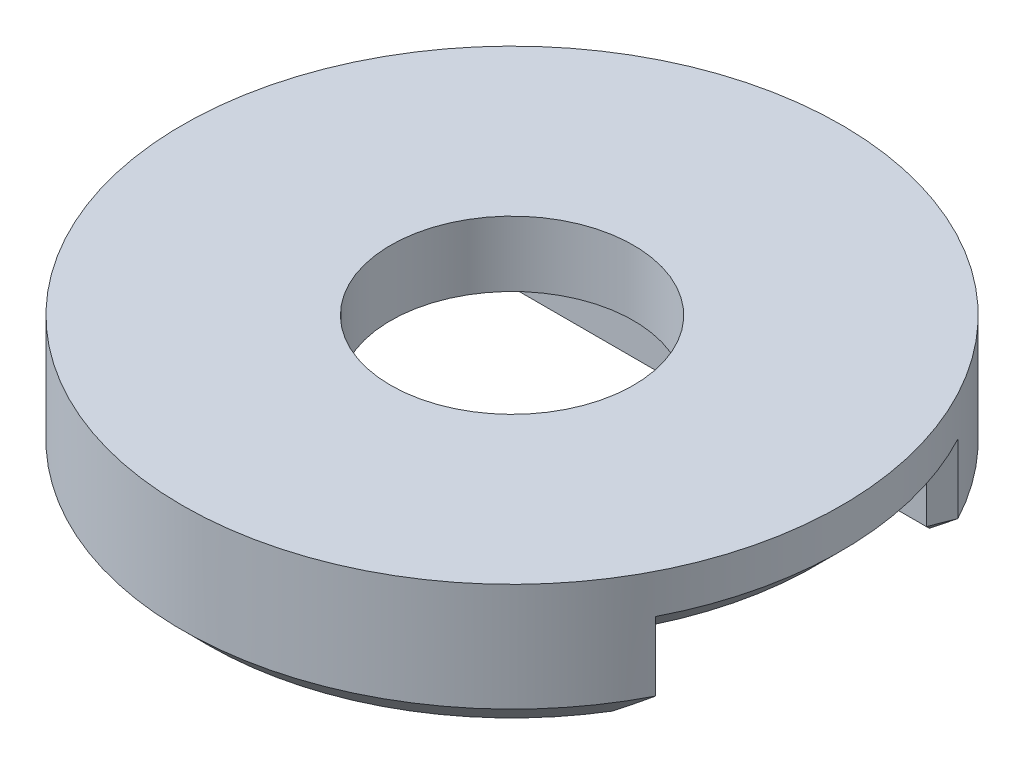
ISO-10303-21;
HEADER;
FILE_DESCRIPTION(('STEP AP214'),'2;1');
FILE_NAME('part.step','',(''),(''),'','','');
FILE_SCHEMA(('AUTOMOTIVE_DESIGN { 1 0 10303 214 1 1 1 1 }'));
ENDSEC;
DATA;
#1=APPLICATION_CONTEXT('core data for automotive mechanical design processes');
#2=APPLICATION_PROTOCOL_DEFINITION('international standard','automotive_design',2000,#1);
#3=PRODUCT_CONTEXT('',#1,'mechanical');
#4=PRODUCT('Part','Part','',(#3));
#5=PRODUCT_RELATED_PRODUCT_CATEGORY('part','',(#4));
#6=PRODUCT_DEFINITION_FORMATION('','',#4);
#7=PRODUCT_DEFINITION_CONTEXT('part definition',#1,'design');
#8=PRODUCT_DEFINITION('design','',#6,#7);
#9=PRODUCT_DEFINITION_SHAPE('','',#8);
#10=(LENGTH_UNIT() NAMED_UNIT(*) SI_UNIT(.MILLI.,.METRE.));
#11=(NAMED_UNIT(*) PLANE_ANGLE_UNIT() SI_UNIT($,.RADIAN.));
#12=(NAMED_UNIT(*) SI_UNIT($,.STERADIAN.) SOLID_ANGLE_UNIT());
#13=UNCERTAINTY_MEASURE_WITH_UNIT(LENGTH_MEASURE(1.E-05),#10,'distance_accuracy_value','');
#14=(GEOMETRIC_REPRESENTATION_CONTEXT(3) GLOBAL_UNCERTAINTY_ASSIGNED_CONTEXT((#13)) GLOBAL_UNIT_ASSIGNED_CONTEXT((#10,
#11,#12)) REPRESENTATION_CONTEXT('',''));
#15=CARTESIAN_POINT('',(0.,0.,0.));
#16=DIRECTION('',(0.,0.,1.));
#17=DIRECTION('',(1.,0.,0.));
#18=AXIS2_PLACEMENT_3D('',#15,#16,#17);
#19=CARTESIAN_POINT('',(0.,0.,0.));
#20=DIRECTION('',(0.,1.,0.));
#21=DIRECTION('',(0.,0.,1.));
#22=AXIS2_PLACEMENT_3D('',#19,#20,#21);
#23=PLANE('',#22);
#24=CARTESIAN_POINT('',(0.,0.,0.));
#25=DIRECTION('',(0.,1.,0.));
#26=DIRECTION('',(0.,0.,1.));
#27=AXIS2_PLACEMENT_3D('',#24,#25,#26);
#28=CIRCLE('',#27,23.622);
#29=CARTESIAN_POINT('',(0.,0.,23.622));
#30=VERTEX_POINT('',#29);
#31=EDGE_CURVE('E158',#30,#30,#28,.T.);
#32=ORIENTED_EDGE('',*,*,#31,.T.);
#33=EDGE_LOOP('',(#32));
#34=FACE_BOUND('',#33,.T.);
#35=DIRECTION('',(1.,0.,0.));
#36=VECTOR('',#35,1.);
#37=CARTESIAN_POINT('',(0.,0.,-25.7175));
#38=LINE('',#37,#36);
#39=CARTESIAN_POINT('',(-53.1611062596519,0.,-25.7175));
#40=VERTEX_POINT('',#39);
#41=CARTESIAN_POINT('',(53.1611062596519,0.,-25.7175));
#42=VERTEX_POINT('',#41);
#43=EDGE_CURVE('E159',#40,#42,#38,.T.);
#44=ORIENTED_EDGE('',*,*,#43,.T.);
#45=CARTESIAN_POINT('',(0.,0.,0.));
#46=DIRECTION('',(0.,1.,0.));
#47=DIRECTION('',(0.,0.,1.));
#48=AXIS2_PLACEMENT_3D('',#45,#46,#47);
#49=CIRCLE('',#48,59.055);
#50=CARTESIAN_POINT('',(53.1611062596519,0.,25.7175));
#51=VERTEX_POINT('',#50);
#52=EDGE_CURVE('E156',#42,#51,#49,.F.);
#53=ORIENTED_EDGE('',*,*,#52,.T.);
#54=DIRECTION('',(1.,0.,0.));
#55=VECTOR('',#54,1.);
#56=CARTESIAN_POINT('',(0.,0.,25.7175));
#57=LINE('',#56,#55);
#58=CARTESIAN_POINT('',(-53.1611062596519,0.,25.7175));
#59=VERTEX_POINT('',#58);
#60=EDGE_CURVE('E140',#59,#51,#57,.T.);
#61=ORIENTED_EDGE('',*,*,#60,.F.);
#62=CARTESIAN_POINT('',(0.,0.,0.));
#63=DIRECTION('',(0.,1.,0.));
#64=DIRECTION('',(0.,0.,1.));
#65=AXIS2_PLACEMENT_3D('',#62,#63,#64);
#66=CIRCLE('',#65,59.055);
#67=EDGE_CURVE('E153',#59,#40,#66,.F.);
#68=ORIENTED_EDGE('',*,*,#67,.T.);
#69=EDGE_LOOP('',(#44,#53,#61,#68));
#70=FACE_BOUND('',#69,.T.);
#71=ADVANCED_FACE('F39',(#34,#70),#23,.F.);
#72=CARTESIAN_POINT('',(0.,12.7,0.));
#73=DIRECTION('',(0.,-1.,0.));
#74=DIRECTION('',(0.,0.,-1.));
#75=AXIS2_PLACEMENT_3D('',#72,#73,#74);
#76=CYLINDRICAL_SURFACE('',#75,64.135);
#77=DIRECTION('',(0.,-1.,0.));
#78=VECTOR('',#77,1.);
#79=CARTESIAN_POINT('',(-56.6196296357669,12.7,30.125002322134));
#80=LINE('',#79,#78);
#81=CARTESIAN_POINT('',(-56.6196296357669,5.08,30.125002322134));
#82=VERTEX_POINT('',#81);
#83=CARTESIAN_POINT('',(-56.6196296357669,-8.3312,30.125002322134));
#84=VERTEX_POINT('',#83);
#85=EDGE_CURVE('E387',#82,#84,#80,.T.);
#86=ORIENTED_EDGE('',*,*,#85,.T.);
#87=CARTESIAN_POINT('',(0.,-8.3312,0.));
#88=DIRECTION('',(0.,1.,0.));
#89=DIRECTION('',(0.,0.,1.));
#90=AXIS2_PLACEMENT_3D('',#87,#88,#89);
#91=CIRCLE('',#90,64.135);
#92=CARTESIAN_POINT('',(57.1201882916864,-8.3312,29.1647443760834));
#93=VERTEX_POINT('',#92);
#94=EDGE_CURVE('E391',#84,#93,#91,.T.);
#95=ORIENTED_EDGE('',*,*,#94,.T.);
#96=DIRECTION('',(0.,-1.,0.));
#97=VECTOR('',#96,1.);
#98=CARTESIAN_POINT('',(57.1201882916864,12.7,29.1647443760834));
#99=LINE('',#98,#97);
#100=CARTESIAN_POINT('',(57.1201882916864,5.08,29.1647443760834));
#101=VERTEX_POINT('',#100);
#102=EDGE_CURVE('E384',#93,#101,#99,.F.);
#103=ORIENTED_EDGE('',*,*,#102,.T.);
#104=CARTESIAN_POINT('',(0.,5.08,0.));
#105=DIRECTION('',(0.,1.,0.));
#106=DIRECTION('',(0.,0.,1.));
#107=AXIS2_PLACEMENT_3D('',#104,#105,#106);
#108=CIRCLE('',#107,64.135);
#109=CARTESIAN_POINT('',(56.6196296357669,5.08,-30.1250023221341));
#110=VERTEX_POINT('',#109);
#111=EDGE_CURVE('E381',#101,#110,#108,.T.);
#112=ORIENTED_EDGE('',*,*,#111,.T.);
#113=DIRECTION('',(0.,-1.,0.));
#114=VECTOR('',#113,1.);
#115=CARTESIAN_POINT('',(56.6196296357669,12.7,-30.1250023221341));
#116=LINE('',#115,#114);
#117=CARTESIAN_POINT('',(56.6196296357669,-8.3312,-30.1250023221341));
#118=VERTEX_POINT('',#117);
#119=EDGE_CURVE('E372',#110,#118,#116,.T.);
#120=ORIENTED_EDGE('',*,*,#119,.T.);
#121=CARTESIAN_POINT('',(0.,-8.3312,0.));
#122=DIRECTION('',(0.,1.,0.));
#123=DIRECTION('',(0.,0.,1.));
#124=AXIS2_PLACEMENT_3D('',#121,#122,#123);
#125=CIRCLE('',#124,64.135);
#126=CARTESIAN_POINT('',(-57.1201882916864,-8.3312,-29.1647443760834));
#127=VERTEX_POINT('',#126);
#128=EDGE_CURVE('E369',#118,#127,#125,.T.);
#129=ORIENTED_EDGE('',*,*,#128,.T.);
#130=DIRECTION('',(0.,-1.,0.));
#131=VECTOR('',#130,1.);
#132=CARTESIAN_POINT('',(-57.1201882916864,12.7,-29.1647443760834));
#133=LINE('',#132,#131);
#134=CARTESIAN_POINT('',(-57.1201882916864,5.08,-29.1647443760834));
#135=VERTEX_POINT('',#134);
#136=EDGE_CURVE('E375',#127,#135,#133,.F.);
#137=ORIENTED_EDGE('',*,*,#136,.T.);
#138=CARTESIAN_POINT('',(0.,5.08,0.));
#139=DIRECTION('',(0.,1.,0.));
#140=DIRECTION('',(0.,0.,1.));
#141=AXIS2_PLACEMENT_3D('',#138,#139,#140);
#142=CIRCLE('',#141,64.135);
#143=EDGE_CURVE('E378',#135,#82,#142,.T.);
#144=ORIENTED_EDGE('',*,*,#143,.T.);
#145=EDGE_LOOP('',(#86,#95,#103,#112,#120,#129,#137,#144));
#146=FACE_BOUND('',#145,.T.);
#147=CARTESIAN_POINT('',(0.,12.7,0.));
#148=DIRECTION('',(0.,1.,0.));
#149=DIRECTION('',(0.,0.,1.));
#150=AXIS2_PLACEMENT_3D('',#147,#148,#149);
#151=CIRCLE('',#150,64.135);
#152=CARTESIAN_POINT('',(0.,12.7,64.135));
#153=VERTEX_POINT('',#152);
#154=EDGE_CURVE('E355',#153,#153,#151,.T.);
#155=ORIENTED_EDGE('',*,*,#154,.F.);
#156=EDGE_LOOP('',(#155));
#157=FACE_BOUND('',#156,.T.);
#158=ADVANCED_FACE('F331',(#146,#157),#76,.T.);
#159=CARTESIAN_POINT('',(0.,12.7,0.));
#160=DIRECTION('',(0.,-1.,0.));
#161=DIRECTION('',(0.,0.,-1.));
#162=AXIS2_PLACEMENT_3D('',#159,#160,#161);
#163=CYLINDRICAL_SURFACE('',#162,23.622);
#164=CARTESIAN_POINT('',(0.,12.7,0.));
#165=DIRECTION('',(0.,1.,0.));
#166=DIRECTION('',(0.,0.,1.));
#167=AXIS2_PLACEMENT_3D('',#164,#165,#166);
#168=CIRCLE('',#167,23.622);
#169=CARTESIAN_POINT('',(0.,12.7,23.622));
#170=VERTEX_POINT('',#169);
#171=EDGE_CURVE('E352',#170,#170,#168,.T.);
#172=ORIENTED_EDGE('',*,*,#171,.T.);
#173=EDGE_LOOP('',(#172));
#174=FACE_BOUND('',#173,.T.);
#175=ORIENTED_EDGE('',*,*,#31,.F.);
#176=EDGE_LOOP('',(#175));
#177=FACE_BOUND('',#176,.T.);
#178=ADVANCED_FACE('F337',(#174,#177),#163,.F.);
#179=CARTESIAN_POINT('',(0.,12.7,0.));
#180=DIRECTION('',(0.,1.,0.));
#181=DIRECTION('',(0.,0.,1.));
#182=AXIS2_PLACEMENT_3D('',#179,#180,#181);
#183=PLANE('',#182);
#184=ORIENTED_EDGE('',*,*,#154,.T.);
#185=EDGE_LOOP('',(#184));
#186=FACE_BOUND('',#185,.T.);
#187=ORIENTED_EDGE('',*,*,#171,.F.);
#188=EDGE_LOOP('',(#187));
#189=FACE_BOUND('',#188,.T.);
#190=ADVANCED_FACE('F342',(#186,#189),#183,.T.);
#191=CARTESIAN_POINT('',(0.,-13.4112,25.7175));
#192=DIRECTION('',(0.,0.,1.));
#193=DIRECTION('',(1.,0.,0.));
#194=AXIS2_PLACEMENT_3D('',#191,#192,#193);
#195=PLANE('',#194);
#196=DIRECTION('',(-1.,0.,0.));
#197=VECTOR('',#196,1.);
#198=CARTESIAN_POINT('',(0.,-8.3312,25.7175));
#199=LINE('',#198,#197);
#200=CARTESIAN_POINT('',(53.672943915603,-8.3312,25.7175));
#201=VERTEX_POINT('',#200);
#202=CARTESIAN_POINT('',(-54.8959048745212,-8.3312,25.7175));
#203=VERTEX_POINT('',#202);
#204=EDGE_CURVE('E362',#201,#203,#199,.T.);
#205=ORIENTED_EDGE('',*,*,#204,.T.);
#206=DIRECTION('',(0.,1.,0.));
#207=VECTOR('',#206,1.);
#208=CARTESIAN_POINT('',(-54.8959048745212,-13.4112,25.7175));
#209=LINE('',#208,#207);
#210=CARTESIAN_POINT('',(-54.8959048745212,1.56636734058775,25.7175));
#211=VERTEX_POINT('',#210);
#212=EDGE_CURVE('E143',#203,#211,#209,.T.);
#213=ORIENTED_EDGE('',*,*,#212,.T.);
#214=CARTESIAN_POINT('',(-54.8959048745212,1.56636734058775,25.7175));
#215=CARTESIAN_POINT('',(-54.6071569328278,1.30487954422318,25.7175));
#216=CARTESIAN_POINT('',(-54.3182164117731,1.04360503525342,25.7175));
#217=CARTESIAN_POINT('',(-53.7399502068221,0.521482588384765,25.7175));
#218=CARTESIAN_POINT('',(-53.4506245229204,0.260634650491936,25.7175));
#219=CARTESIAN_POINT('',(-53.1611062596519,0.,25.7175));
#220=B_SPLINE_CURVE_WITH_KNOTS('',3,(#214,#215,#216,#217,#218,#219),.UNSPECIFIED.,.F.,.F.,(4,2,
4),(0.,1.16865689734112,2.3373138113296),.UNSPECIFIED.);
#221=EDGE_CURVE('E55',#211,#59,#220,.T.);
#222=ORIENTED_EDGE('',*,*,#221,.T.);
#223=ORIENTED_EDGE('',*,*,#60,.T.);
#224=CARTESIAN_POINT('',(53.1611062596519,0.,25.7175));
#225=CARTESIAN_POINT('',(53.2464469957497,0.0768237334276907,25.7175));
#226=CARTESIAN_POINT('',(53.3317705018029,0.153666589846451,25.7175));
#227=CARTESIAN_POINT('',(53.5023830537866,0.307390548636063,25.7175));
#228=CARTESIAN_POINT('',(53.5876720997172,0.384271651006899,25.7175));
#229=CARTESIAN_POINT('',(53.672943915603,0.46117187636879,25.7175));
#230=B_SPLINE_CURVE_WITH_KNOTS('',3,(#224,#225,#226,#227,#228,#229),.UNSPECIFIED.,.F.,.F.,(4,2,
4),(0.,0.344476889515438,0.68895377889621),.UNSPECIFIED.);
#231=CARTESIAN_POINT('',(53.672943915603,0.461171876368791,25.7175));
#232=VERTEX_POINT('',#231);
#233=EDGE_CURVE('E149',#51,#232,#230,.T.);
#234=ORIENTED_EDGE('',*,*,#233,.T.);
#235=DIRECTION('',(0.,-1.,0.));
#236=VECTOR('',#235,1.);
#237=CARTESIAN_POINT('',(53.672943915603,-13.4112,25.7175));
#238=LINE('',#237,#236);
#239=EDGE_CURVE('E63',#232,#201,#238,.T.);
#240=ORIENTED_EDGE('',*,*,#239,.T.);
#241=EDGE_LOOP('',(#205,#213,#222,#223,#234,#240));
#242=FACE_BOUND('',#241,.T.);
#243=ADVANCED_FACE('F139',(#242),#195,.F.);
#244=CARTESIAN_POINT('',(0.,-13.4112,0.));
#245=DIRECTION('',(0.,1.,0.));
#246=DIRECTION('',(0.,0.,1.));
#247=AXIS2_PLACEMENT_3D('',#244,#245,#246);
#248=PLANE('',#247);
#249=CARTESIAN_POINT('',(0.,-13.4112,0.));
#250=DIRECTION('',(0.,1.,0.));
#251=DIRECTION('',(0.,0.,1.));
#252=AXIS2_PLACEMENT_3D('',#249,#250,#251);
#253=CIRCLE('',#252,59.055);
#254=CARTESIAN_POINT('',(50.388560395689,-13.4112,30.7975));
#255=VERTEX_POINT('',#254);
#256=CARTESIAN_POINT('',(-50.388560395689,-13.4112,30.7975));
#257=VERTEX_POINT('',#256);
#258=EDGE_CURVE('E169',#255,#257,#253,.F.);
#259=ORIENTED_EDGE('',*,*,#258,.T.);
#260=DIRECTION('',(1.,0.,0.));
#261=VECTOR('',#260,1.);
#262=CARTESIAN_POINT('',(0.,-13.4112,30.7975));
#263=LINE('',#262,#261);
#264=EDGE_CURVE('E176',#257,#255,#263,.T.);
#265=ORIENTED_EDGE('',*,*,#264,.T.);
#266=EDGE_LOOP('',(#259,#265));
#267=FACE_BOUND('',#266,.T.);
#268=ADVANCED_FACE('F209',(#267),#248,.F.);
#269=CARTESIAN_POINT('',(0.,-13.4112,-25.7175));
#270=DIRECTION('',(0.,0.,1.));
#271=DIRECTION('',(1.,0.,0.));
#272=AXIS2_PLACEMENT_3D('',#269,#270,#271);
#273=PLANE('',#272);
#274=ORIENTED_EDGE('',*,*,#43,.F.);
#275=CARTESIAN_POINT('',(-53.1611062596519,0.,-25.7175));
#276=CARTESIAN_POINT('',(-53.2464469957497,0.0768237334276886,-25.7175));
#277=CARTESIAN_POINT('',(-53.3317705018029,0.153666589846447,-25.7175));
#278=CARTESIAN_POINT('',(-53.5023830537866,0.307390548636055,-25.7175));
#279=CARTESIAN_POINT('',(-53.5876720997172,0.38427165100689,-25.7175));
#280=CARTESIAN_POINT('',(-53.672943915603,0.46117187636878,-25.7175));
#281=B_SPLINE_CURVE_WITH_KNOTS('',3,(#275,#276,#277,#278,#279,#280),.UNSPECIFIED.,.F.,.F.,(4,2,
4),(0.,0.344476889515429,0.688953778896193),.UNSPECIFIED.);
#282=CARTESIAN_POINT('',(-53.672943915603,0.461171876368778,-25.7175));
#283=VERTEX_POINT('',#282);
#284=EDGE_CURVE('E11',#40,#283,#281,.T.);
#285=ORIENTED_EDGE('',*,*,#284,.T.);
#286=DIRECTION('',(0.,-1.,0.));
#287=VECTOR('',#286,1.);
#288=CARTESIAN_POINT('',(-53.672943915603,-13.4112,-25.7175));
#289=LINE('',#288,#287);
#290=CARTESIAN_POINT('',(-53.672943915603,-8.3312,-25.7175));
#291=VERTEX_POINT('',#290);
#292=EDGE_CURVE('E165',#283,#291,#289,.T.);
#293=ORIENTED_EDGE('',*,*,#292,.T.);
#294=DIRECTION('',(1.,0.,0.));
#295=VECTOR('',#294,1.);
#296=CARTESIAN_POINT('',(58.7529439156031,-8.3312,-25.7175));
#297=LINE('',#296,#295);
#298=CARTESIAN_POINT('',(54.8959048745211,-8.3312,-25.7175));
#299=VERTEX_POINT('',#298);
#300=EDGE_CURVE('E394',#291,#299,#297,.T.);
#301=ORIENTED_EDGE('',*,*,#300,.T.);
#302=DIRECTION('',(0.,1.,0.));
#303=VECTOR('',#302,1.);
#304=CARTESIAN_POINT('',(54.8959048745211,0.,-25.7175));
#305=LINE('',#304,#303);
#306=CARTESIAN_POINT('',(54.8959048745211,1.56636734058771,-25.7175));
#307=VERTEX_POINT('',#306);
#308=EDGE_CURVE('E71',#299,#307,#305,.T.);
#309=ORIENTED_EDGE('',*,*,#308,.T.);
#310=CARTESIAN_POINT('',(54.8959048745211,1.56636734058771,-25.7175));
#311=CARTESIAN_POINT('',(54.6071569328278,1.30487954422314,-25.7175));
#312=CARTESIAN_POINT('',(54.3182164117731,1.04360503525339,-25.7175));
#313=CARTESIAN_POINT('',(53.7399502068221,0.521482588384747,-25.7175));
#314=CARTESIAN_POINT('',(53.4506245229204,0.260634650491926,-25.7175));
#315=CARTESIAN_POINT('',(53.1611062596519,0.,-25.7175));
#316=B_SPLINE_CURVE_WITH_KNOTS('',3,(#310,#311,#312,#313,#314,#315),.UNSPECIFIED.,.F.,.F.,(4,2,
4),(0.,1.16865689734109,2.33731381132953),.UNSPECIFIED.);
#317=EDGE_CURVE('E187',#307,#42,#316,.T.);
#318=ORIENTED_EDGE('',*,*,#317,.T.);
#319=EDGE_LOOP('',(#274,#285,#293,#301,#309,#318));
#320=FACE_BOUND('',#319,.T.);
#321=ADVANCED_FACE('F203',(#320),#273,.T.);
#322=CARTESIAN_POINT('',(0.,-13.4112,0.));
#323=DIRECTION('',(0.,1.,0.));
#324=DIRECTION('',(0.,0.,1.));
#325=AXIS2_PLACEMENT_3D('',#322,#323,#324);
#326=PLANE('',#325);
#327=CARTESIAN_POINT('',(0.,-13.4112,0.));
#328=DIRECTION('',(0.,1.,0.));
#329=DIRECTION('',(0.,0.,1.));
#330=AXIS2_PLACEMENT_3D('',#327,#328,#329);
#331=CIRCLE('',#330,59.055);
#332=CARTESIAN_POINT('',(-50.388560395689,-13.4112,-30.7975));
#333=VERTEX_POINT('',#332);
#334=CARTESIAN_POINT('',(50.388560395689,-13.4112,-30.7975));
#335=VERTEX_POINT('',#334);
#336=EDGE_CURVE('E180',#333,#335,#331,.F.);
#337=ORIENTED_EDGE('',*,*,#336,.T.);
#338=DIRECTION('',(-1.,0.,0.));
#339=VECTOR('',#338,1.);
#340=CARTESIAN_POINT('',(-58.7529439156031,-13.4112,-30.7975));
#341=LINE('',#340,#339);
#342=EDGE_CURVE('E183',#335,#333,#341,.T.);
#343=ORIENTED_EDGE('',*,*,#342,.T.);
#344=EDGE_LOOP('',(#337,#343));
#345=FACE_BOUND('',#344,.T.);
#346=ADVANCED_FACE('F208',(#345),#326,.F.);
#347=CARTESIAN_POINT('',(54.8959048745211,12.7,-25.7175));
#348=DIRECTION('',(0.931310886451406,0.,0.36422525005427));
#349=DIRECTION('',(0.,-1.,0.));
#350=AXIS2_PLACEMENT_3D('',#347,#348,#349);
#351=PLANE('',#350);
#352=DIRECTION('',(-0.36422525005427,0.,0.931310886451406));
#353=VECTOR('',#352,1.);
#354=CARTESIAN_POINT('',(56.6196296357669,-8.3312,-30.1250023221341));
#355=LINE('',#354,#353);
#356=EDGE_CURVE('E295',#118,#299,#355,.T.);
#357=ORIENTED_EDGE('',*,*,#356,.F.);
#358=ORIENTED_EDGE('',*,*,#119,.F.);
#359=CARTESIAN_POINT('',(54.8959048745211,1.56636734058771,-25.7175));
#360=CARTESIAN_POINT('',(55.0407588236509,1.85467225427372,-26.0878863467728));
#361=CARTESIAN_POINT('',(55.1852918696564,2.1441909156365,-26.4574521557795));
#362=CARTESIAN_POINT('',(55.47374048349,2.72551305980094,-27.195004904264));
#363=CARTESIAN_POINT('',(55.617656069791,3.01731647349943,-27.5629918909768));
#364=CARTESIAN_POINT('',(55.9049024560769,3.6030821003267,-28.2974705867893));
#365=CARTESIAN_POINT('',(56.0482332575327,3.89704430802018,-28.6639622996502));
#366=CARTESIAN_POINT('',(56.3343411905882,4.48701755648788,-29.3955300114304));
#367=CARTESIAN_POINT('',(56.477118305377,4.7830286587226,-29.7606059673644));
#368=CARTESIAN_POINT('',(56.6196296357669,5.07999999999998,-30.1250023221341));
#369=B_SPLINE_CURVE_WITH_KNOTS('',3,(#359,#360,#361,#362,#363,#364,#365,#366,#367,#368),
.UNSPECIFIED.,.F.,.F.,(4,2,2,2,4),(0.,1.47362990817354,2.94721541673099,4.42079721643346,
5.89442341227714),.UNSPECIFIED.);
#370=EDGE_CURVE('E44',#307,#110,#369,.T.);
#371=ORIENTED_EDGE('',*,*,#370,.F.);
#372=ORIENTED_EDGE('',*,*,#308,.F.);
#373=EDGE_LOOP('',(#357,#358,#371,#372));
#374=FACE_BOUND('',#373,.T.);
#375=ADVANCED_FACE('F41',(#374),#351,.T.);
#376=CARTESIAN_POINT('',(0.,5.08,0.));
#377=DIRECTION('',(0.,1.,0.));
#378=DIRECTION('',(0.,0.,1.));
#379=AXIS2_PLACEMENT_3D('',#376,#377,#378);
#380=CONICAL_SURFACE('',#379,64.135,0.78539816339745);
#381=ORIENTED_EDGE('',*,*,#370,.T.);
#382=ORIENTED_EDGE('',*,*,#111,.F.);
#383=CARTESIAN_POINT('',(57.1201882916864,5.08,29.1647443760834));
#384=CARTESIAN_POINT('',(56.8334750206249,4.69426679462589,28.8780311050219));
#385=CARTESIAN_POINT('',(56.546633141525,4.30872472818162,28.5911892259219));
#386=CARTESIAN_POINT('',(55.972676680568,3.5380477103738,28.017232764965));
#387=CARTESIAN_POINT('',(55.6855620990201,3.15291275854994,27.730118183417));
#388=CARTESIAN_POINT('',(55.1110440636127,2.38307388846689,27.1556001480097));
#389=CARTESIAN_POINT('',(54.8236406097192,1.99836997025854,26.8681966941162));
#390=CARTESIAN_POINT('',(54.2485267963694,1.22942030424789,26.2930828807663));
#391=CARTESIAN_POINT('',(53.9608164365659,0.845174556964751,26.0053725209629));
#392=CARTESIAN_POINT('',(53.672943915603,0.461171876368791,25.7175));
#393=B_SPLINE_CURVE_WITH_KNOTS('',3,(#383,#384,#385,#386,#387,#388,#389,#390,#391,#392),
.UNSPECIFIED.,.F.,.F.,(4,2,2,2,4),(0.,1.67892581721045,3.3578497340127,5.03677384879088,
6.71569986418836),.UNSPECIFIED.);
#394=EDGE_CURVE('E289',#232,#101,#393,.F.);
#395=ORIENTED_EDGE('',*,*,#394,.F.);
#396=ORIENTED_EDGE('',*,*,#233,.F.);
#397=ORIENTED_EDGE('',*,*,#52,.F.);
#398=ORIENTED_EDGE('',*,*,#317,.F.);
#399=EDGE_LOOP('',(#381,#382,#395,#396,#397,#398));
#400=FACE_BOUND('',#399,.T.);
#401=ADVANCED_FACE('F200',(#400),#380,.T.);
#402=CARTESIAN_POINT('',(56.6196296357669,-8.3312,-30.1250023221341));
#403=DIRECTION('',(0.598989480804955,-0.765724987981278,0.234258072787432));
#404=DIRECTION('',(0.78764154969396,0.616133742945228,0.));
#405=AXIS2_PLACEMENT_3D('',#402,#403,#404);
#406=PLANE('',#405);
#407=CARTESIAN_POINT('',(77.1928643713152,26.2141725894024,30.189264119071));
#408=DIRECTION('',(0.598989480804955,-0.765724987981278,0.234258072787432));
#409=DIRECTION('',(0.713128017334837,0.643168129481764,0.278896375220284));
#410=AXIS2_PLACEMENT_3D('',#407,#408,#409);
#411=ELLIPSE('',#410,128.871819698034,53.5507792332101);
#412=EDGE_CURVE('E281',#118,#335,#411,.F.);
#413=ORIENTED_EDGE('',*,*,#412,.F.);
#414=ORIENTED_EDGE('',*,*,#356,.T.);
#415=DIRECTION('',(-0.531457912857831,-0.598979334727333,-0.598979334727334));
#416=VECTOR('',#415,1.);
#417=CARTESIAN_POINT('',(53.9797162640098,-9.36378984602917,-26.7500898460292));
#418=LINE('',#417,#416);
#419=EDGE_CURVE('E285',#335,#299,#418,.F.);
#420=ORIENTED_EDGE('',*,*,#419,.F.);
#421=EDGE_LOOP('',(#413,#414,#420));
#422=FACE_BOUND('',#421,.T.);
#423=ADVANCED_FACE('F301',(#422),#406,.T.);
#424=CARTESIAN_POINT('',(57.1201882916864,12.7,29.1647443760834));
#425=DIRECTION('',(0.707106781186545,0.,-0.70710678118655));
#426=DIRECTION('',(0.,-1.,0.));
#427=AXIS2_PLACEMENT_3D('',#424,#425,#426);
#428=PLANE('',#427);
#429=ORIENTED_EDGE('',*,*,#394,.T.);
#430=ORIENTED_EDGE('',*,*,#102,.F.);
#431=DIRECTION('',(0.70710678118655,0.,0.707106781186545));
#432=VECTOR('',#431,1.);
#433=CARTESIAN_POINT('',(53.672943915603,-8.3312,25.7175));
#434=LINE('',#433,#432);
#435=EDGE_CURVE('E277',#201,#93,#434,.T.);
#436=ORIENTED_EDGE('',*,*,#435,.F.);
#437=ORIENTED_EDGE('',*,*,#239,.F.);
#438=EDGE_LOOP('',(#429,#430,#436,#437));
#439=FACE_BOUND('',#438,.T.);
#440=ADVANCED_FACE('F296',(#439),#428,.T.);
#441=CARTESIAN_POINT('',(0.,-8.3312,-25.7175));
#442=DIRECTION('',(0.,-0.707106781186548,0.707106781186547));
#443=DIRECTION('',(-1.,0.,0.));
#444=AXIS2_PLACEMENT_3D('',#441,#442,#443);
#445=PLANE('',#444);
#446=ORIENTED_EDGE('',*,*,#419,.T.);
#447=ORIENTED_EDGE('',*,*,#300,.F.);
#448=DIRECTION('',(-0.415778143838364,0.643089626376574,0.643089626376576));
#449=VECTOR('',#448,1.);
#450=CARTESIAN_POINT('',(-53.672943915603,-8.3312,-25.7175));
#451=LINE('',#450,#449);
#452=EDGE_CURVE('E273',#333,#291,#451,.T.);
#453=ORIENTED_EDGE('',*,*,#452,.F.);
#454=ORIENTED_EDGE('',*,*,#342,.F.);
#455=EDGE_LOOP('',(#446,#447,#453,#454));
#456=FACE_BOUND('',#455,.T.);
#457=ADVANCED_FACE('F300',(#456),#445,.T.);
#458=CARTESIAN_POINT('',(0.,-8.3312,0.));
#459=DIRECTION('',(0.,1.,0.));
#460=DIRECTION('',(0.,0.,1.));
#461=AXIS2_PLACEMENT_3D('',#458,#459,#460);
#462=CONICAL_SURFACE('',#461,64.135,0.78539816339745);
#463=ORIENTED_EDGE('',*,*,#412,.T.);
#464=ORIENTED_EDGE('',*,*,#336,.F.);
#465=CARTESIAN_POINT('',(-109.194719497002,107.326420516213,109.194719497003));
#466=DIRECTION('',(-0.460723433468101,-0.758595963413151,0.460723433468103));
#467=DIRECTION('',(-0.53640834991018,0.651561328113688,0.536408349910183));
#468=AXIS2_PLACEMENT_3D('',#465,#466,#467);
#469=ELLIPSE('',#468,237.007088341562,92.0782974431483);
#470=EDGE_CURVE('E270',#127,#333,#469,.T.);
#471=ORIENTED_EDGE('',*,*,#470,.F.);
#472=ORIENTED_EDGE('',*,*,#128,.F.);
#473=EDGE_LOOP('',(#463,#464,#471,#472));
#474=FACE_BOUND('',#473,.T.);
#475=ADVANCED_FACE('F304',(#474),#462,.T.);
#476=CARTESIAN_POINT('',(53.672943915603,-8.3312,25.7175));
#477=DIRECTION('',(0.4607234334681,-0.758595963413152,-0.460723433468103));
#478=DIRECTION('',(0.,0.519099402857157,-0.854713876073943));
#479=AXIS2_PLACEMENT_3D('',#476,#477,#478);
#480=PLANE('',#479);
#481=DIRECTION('',(-0.415778143838366,-0.643089626376573,0.643089626376575));
#482=VECTOR('',#481,1.);
#483=CARTESIAN_POINT('',(53.672943915603,-8.3312,25.7175));
#484=LINE('',#483,#482);
#485=EDGE_CURVE('E262',#201,#255,#484,.T.);
#486=ORIENTED_EDGE('',*,*,#485,.F.);
#487=ORIENTED_EDGE('',*,*,#435,.T.);
#488=CARTESIAN_POINT('',(109.194719497001,107.326420516211,-109.194719497001));
#489=DIRECTION('',(0.4607234334681,-0.758595963413152,-0.460723433468103));
#490=DIRECTION('',(0.53640834991018,0.651561328113687,-0.536408349910183));
#491=AXIS2_PLACEMENT_3D('',#488,#489,#490);
#492=ELLIPSE('',#491,237.007088341559,92.0782974431478);
#493=EDGE_CURVE('E266',#255,#93,#492,.F.);
#494=ORIENTED_EDGE('',*,*,#493,.F.);
#495=EDGE_LOOP('',(#486,#487,#494));
#496=FACE_BOUND('',#495,.T.);
#497=ADVANCED_FACE('F308',(#496),#480,.T.);
#498=CARTESIAN_POINT('',(-53.672943915603,-8.3312,-25.7175));
#499=DIRECTION('',(-0.460723433468101,-0.758595963413151,0.460723433468103));
#500=DIRECTION('',(0.,-0.519099402857158,-0.854713876073942));
#501=AXIS2_PLACEMENT_3D('',#498,#499,#500);
#502=PLANE('',#501);
#503=ORIENTED_EDGE('',*,*,#470,.T.);
#504=ORIENTED_EDGE('',*,*,#452,.T.);
#505=DIRECTION('',(-0.707106781186549,0.,-0.707106781186546));
#506=VECTOR('',#505,1.);
#507=CARTESIAN_POINT('',(-53.672943915603,-8.3312,-25.7175));
#508=LINE('',#507,#506);
#509=EDGE_CURVE('E258',#127,#291,#508,.F.);
#510=ORIENTED_EDGE('',*,*,#509,.F.);
#511=EDGE_LOOP('',(#503,#504,#510));
#512=FACE_BOUND('',#511,.T.);
#513=ADVANCED_FACE('F312',(#512),#502,.T.);
#514=CARTESIAN_POINT('',(0.,-8.3312,0.));
#515=DIRECTION('',(0.,1.,0.));
#516=DIRECTION('',(0.,0.,1.));
#517=AXIS2_PLACEMENT_3D('',#514,#515,#516);
#518=CONICAL_SURFACE('',#517,64.135,0.78539816339745);
#519=ORIENTED_EDGE('',*,*,#493,.T.);
#520=ORIENTED_EDGE('',*,*,#94,.F.);
#521=CARTESIAN_POINT('',(-77.1928643713122,26.2141725893993,-30.1892641190697));
#522=DIRECTION('',(-0.598989480804952,-0.765724987981281,-0.234258072787431));
#523=DIRECTION('',(-0.71312801733484,0.643168129481761,-0.278896375220285));
#524=AXIS2_PLACEMENT_3D('',#521,#522,#523);
#525=ELLIPSE('',#524,128.871819698029,53.5507792332095);
#526=EDGE_CURVE('E254',#257,#84,#525,.T.);
#527=ORIENTED_EDGE('',*,*,#526,.F.);
#528=ORIENTED_EDGE('',*,*,#258,.F.);
#529=EDGE_LOOP('',(#519,#520,#527,#528));
#530=FACE_BOUND('',#529,.T.);
#531=ADVANCED_FACE('F316',(#530),#518,.T.);
#532=CARTESIAN_POINT('',(0.,-13.4112,30.7975));
#533=DIRECTION('',(0.,0.707106781186548,0.707106781186547));
#534=DIRECTION('',(1.,0.,0.));
#535=AXIS2_PLACEMENT_3D('',#532,#533,#534);
#536=PLANE('',#535);
#537=ORIENTED_EDGE('',*,*,#485,.T.);
#538=ORIENTED_EDGE('',*,*,#264,.F.);
#539=DIRECTION('',(-0.531457912857836,0.59897933472733,-0.598979334727332));
#540=VECTOR('',#539,1.);
#541=CARTESIAN_POINT('',(-53.9797162640098,-9.36378984602915,26.7500898460292));
#542=LINE('',#541,#540);
#543=EDGE_CURVE('E249',#203,#257,#542,.F.);
#544=ORIENTED_EDGE('',*,*,#543,.F.);
#545=ORIENTED_EDGE('',*,*,#204,.F.);
#546=EDGE_LOOP('',(#537,#538,#544,#545));
#547=FACE_BOUND('',#546,.T.);
#548=ADVANCED_FACE('F320',(#547),#536,.F.);
#549=CARTESIAN_POINT('',(-57.1201882916864,12.7,-29.1647443760834));
#550=DIRECTION('',(-0.707106781186546,0.,0.707106781186549));
#551=DIRECTION('',(0.,-1.,0.));
#552=AXIS2_PLACEMENT_3D('',#549,#550,#551);
#553=PLANE('',#552);
#554=ORIENTED_EDGE('',*,*,#292,.F.);
#555=CARTESIAN_POINT('',(-57.1201882916864,5.08,-29.1647443760834));
#556=CARTESIAN_POINT('',(-56.8334750206249,4.69426679462589,-28.8780311050218));
#557=CARTESIAN_POINT('',(-56.546633141525,4.30872472818162,-28.5911892259219));
#558=CARTESIAN_POINT('',(-55.9726766805681,3.5380477103738,-28.017232764965));
#559=CARTESIAN_POINT('',(-55.6855620990201,3.15291275854993,-27.730118183417));
#560=CARTESIAN_POINT('',(-55.1110440636127,2.38307388846688,-27.1556001480096));
#561=CARTESIAN_POINT('',(-54.8236406097192,1.99836997025853,-26.8681966941162));
#562=CARTESIAN_POINT('',(-54.2485267963694,1.22942030424788,-26.2930828807663));
#563=CARTESIAN_POINT('',(-53.9608164365659,0.845174556964736,-26.0053725209629));
#564=CARTESIAN_POINT('',(-53.672943915603,0.461171876368776,-25.7175));
#565=B_SPLINE_CURVE_WITH_KNOTS('',3,(#555,#556,#557,#558,#559,#560,#561,#562,#563,#564),
.UNSPECIFIED.,.F.,.F.,(4,2,2,2,4),(0.,1.67892581721046,3.3578497340127,5.0367738487909,
6.71569986418838),.UNSPECIFIED.);
#566=EDGE_CURVE('E242',#135,#283,#565,.T.);
#567=ORIENTED_EDGE('',*,*,#566,.F.);
#568=ORIENTED_EDGE('',*,*,#136,.F.);
#569=ORIENTED_EDGE('',*,*,#509,.T.);
#570=EDGE_LOOP('',(#554,#567,#568,#569));
#571=FACE_BOUND('',#570,.T.);
#572=ADVANCED_FACE('F235',(#571),#553,.T.);
#573=CARTESIAN_POINT('',(-56.6196296357669,-8.3312,30.125002322134));
#574=DIRECTION('',(-0.598989480804952,-0.765724987981281,-0.234258072787431));
#575=DIRECTION('',(0.787641549693963,-0.616133742945225,0.));
#576=AXIS2_PLACEMENT_3D('',#573,#574,#575);
#577=PLANE('',#576);
#578=ORIENTED_EDGE('',*,*,#543,.T.);
#579=ORIENTED_EDGE('',*,*,#526,.T.);
#580=DIRECTION('',(0.36422525005427,0.,-0.931310886451407));
#581=VECTOR('',#580,1.);
#582=CARTESIAN_POINT('',(-56.6196296357669,-8.3312,30.125002322134));
#583=LINE('',#582,#581);
#584=EDGE_CURVE('E250',#203,#84,#583,.F.);
#585=ORIENTED_EDGE('',*,*,#584,.F.);
#586=EDGE_LOOP('',(#578,#579,#585));
#587=FACE_BOUND('',#586,.T.);
#588=ADVANCED_FACE('F232',(#587),#577,.T.);
#589=CARTESIAN_POINT('',(0.,5.08,0.));
#590=DIRECTION('',(0.,1.,0.));
#591=DIRECTION('',(0.,0.,1.));
#592=AXIS2_PLACEMENT_3D('',#589,#590,#591);
#593=CONICAL_SURFACE('',#592,64.135,0.78539816339745);
#594=ORIENTED_EDGE('',*,*,#67,.F.);
#595=ORIENTED_EDGE('',*,*,#221,.F.);
#596=CARTESIAN_POINT('',(-54.8959048745212,1.56636734058775,25.7175));
#597=CARTESIAN_POINT('',(-55.0407588236509,1.85467225427376,26.0878863467728));
#598=CARTESIAN_POINT('',(-55.1852918696565,2.14419091563654,26.4574521557795));
#599=CARTESIAN_POINT('',(-55.47374048349,2.72551305980097,27.195004904264));
#600=CARTESIAN_POINT('',(-55.617656069791,3.01731647349945,27.5629918909768));
#601=CARTESIAN_POINT('',(-55.9049024560769,3.60308210032673,28.2974705867893));
#602=CARTESIAN_POINT('',(-56.0482332575327,3.8970443080202,28.6639622996502));
#603=CARTESIAN_POINT('',(-56.3343411905883,4.48701755648789,29.3955300114304));
#604=CARTESIAN_POINT('',(-56.477118305377,4.7830286587226,29.7606059673644));
#605=CARTESIAN_POINT('',(-56.6196296357669,5.07999999999999,30.1250023221341));
#606=B_SPLINE_CURVE_WITH_KNOTS('',3,(#596,#597,#598,#599,#600,#601,#602,#603,#604,#605),
.UNSPECIFIED.,.F.,.F.,(4,2,2,2,4),(0.,1.47362990817352,2.94721541673096,4.42079721643343,
5.89442341227708),.UNSPECIFIED.);
#607=EDGE_CURVE('E221',#82,#211,#606,.F.);
#608=ORIENTED_EDGE('',*,*,#607,.F.);
#609=ORIENTED_EDGE('',*,*,#143,.F.);
#610=ORIENTED_EDGE('',*,*,#566,.T.);
#611=ORIENTED_EDGE('',*,*,#284,.F.);
#612=EDGE_LOOP('',(#594,#595,#608,#609,#610,#611));
#613=FACE_BOUND('',#612,.T.);
#614=ADVANCED_FACE('F162',(#613),#593,.T.);
#615=CARTESIAN_POINT('',(-54.8959048745212,12.7,25.7175));
#616=DIRECTION('',(-0.931310886451406,0.,-0.36422525005427));
#617=DIRECTION('',(0.,-1.,0.));
#618=AXIS2_PLACEMENT_3D('',#615,#616,#617);
#619=PLANE('',#618);
#620=ORIENTED_EDGE('',*,*,#584,.T.);
#621=ORIENTED_EDGE('',*,*,#85,.F.);
#622=ORIENTED_EDGE('',*,*,#607,.T.);
#623=ORIENTED_EDGE('',*,*,#212,.F.);
#624=EDGE_LOOP('',(#620,#621,#622,#623));
#625=FACE_BOUND('',#624,.T.);
#626=ADVANCED_FACE('F231',(#625),#619,.T.);
#627=CLOSED_SHELL('',(#71,#158,#178,#190,#243,#268,#321,#346,#375,#401,#423,#440,#457,#475,#497,
#513,#531,#548,#572,#588,#614,#626));
#628=MANIFOLD_SOLID_BREP('B2',#627);
#629=ADVANCED_BREP_SHAPE_REPRESENTATION('',(#18,#628),#14);
#630=SHAPE_DEFINITION_REPRESENTATION(#9,#629);
ENDSEC;
END-ISO-10303-21;
